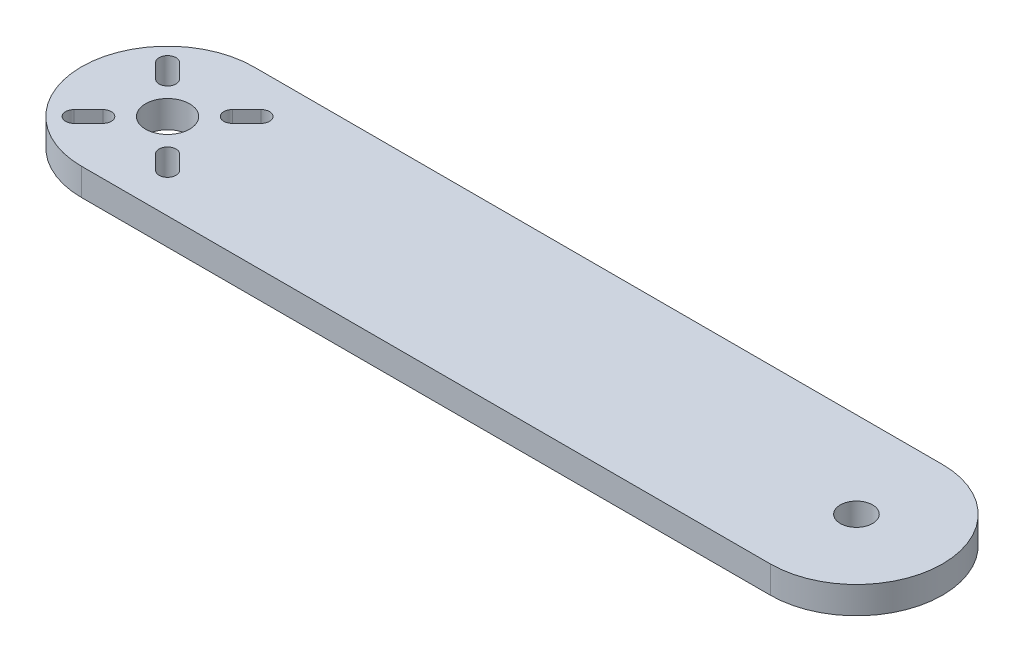
ISO-10303-21;
HEADER;
FILE_DESCRIPTION(('STEP AP214'),'2;1');
FILE_NAME('part.step','',(''),(''),'','','');
FILE_SCHEMA(('AUTOMOTIVE_DESIGN { 1 0 10303 214 1 1 1 1 }'));
ENDSEC;
DATA;
#1=APPLICATION_CONTEXT('core data for automotive mechanical design processes');
#2=APPLICATION_PROTOCOL_DEFINITION('international standard','automotive_design',2000,#1);
#3=PRODUCT_CONTEXT('',#1,'mechanical');
#4=PRODUCT('Part','Part','',(#3));
#5=PRODUCT_RELATED_PRODUCT_CATEGORY('part','',(#4));
#6=PRODUCT_DEFINITION_FORMATION('','',#4);
#7=PRODUCT_DEFINITION_CONTEXT('part definition',#1,'design');
#8=PRODUCT_DEFINITION('design','',#6,#7);
#9=PRODUCT_DEFINITION_SHAPE('','',#8);
#10=(LENGTH_UNIT() NAMED_UNIT(*) SI_UNIT(.MILLI.,.METRE.));
#11=(NAMED_UNIT(*) PLANE_ANGLE_UNIT() SI_UNIT($,.RADIAN.));
#12=(NAMED_UNIT(*) SI_UNIT($,.STERADIAN.) SOLID_ANGLE_UNIT());
#13=UNCERTAINTY_MEASURE_WITH_UNIT(LENGTH_MEASURE(1.E-05),#10,'distance_accuracy_value','');
#14=(GEOMETRIC_REPRESENTATION_CONTEXT(3) GLOBAL_UNCERTAINTY_ASSIGNED_CONTEXT((#13)) GLOBAL_UNIT_ASSIGNED_CONTEXT((#10,
#11,#12)) REPRESENTATION_CONTEXT('',''));
#15=CARTESIAN_POINT('',(0.,0.,0.));
#16=DIRECTION('',(0.,0.,1.));
#17=DIRECTION('',(1.,0.,0.));
#18=AXIS2_PLACEMENT_3D('',#15,#16,#17);
#19=CARTESIAN_POINT('',(50.8,4.,0.));
#20=DIRECTION('',(0.,1.,0.));
#21=DIRECTION('',(0.,0.,1.));
#22=AXIS2_PLACEMENT_3D('',#19,#20,#21);
#23=PLANE('',#22);
#24=DIRECTION('',(0.707106781186583,0.,0.707106781186512));
#25=VECTOR('',#24,1.);
#26=CARTESIAN_POINT('',(-58.5781745930529,4.,-6.01040764008468));
#27=LINE('',#26,#25);
#28=CARTESIAN_POINT('',(-58.5781745930529,4.,-6.01040764008468));
#29=VERTEX_POINT('',#28);
#30=CARTESIAN_POINT('',(-56.4568542494935,4.,-3.88908729652476));
#31=VERTEX_POINT('',#30);
#32=EDGE_CURVE('E279',#29,#31,#27,.T.);
#33=ORIENTED_EDGE('',*,*,#32,.F.);
#34=CARTESIAN_POINT('',(-57.6942911165697,4.,-6.89429111656791));
#35=DIRECTION('',(0.,1.,0.));
#36=DIRECTION('',(0.,0.,1.));
#37=AXIS2_PLACEMENT_3D('',#34,#35,#36);
#38=CIRCLE('',#37,1.25);
#39=CARTESIAN_POINT('',(-56.8104076400866,4.,-7.77817459305114));
#40=VERTEX_POINT('',#39);
#41=EDGE_CURVE('E277',#40,#29,#38,.T.);
#42=ORIENTED_EDGE('',*,*,#41,.F.);
#43=DIRECTION('',(-0.707106781186835,0.,-0.70710678118626));
#44=VECTOR('',#43,1.);
#45=CARTESIAN_POINT('',(-56.8104076400866,4.,-7.77817459305114));
#46=LINE('',#45,#44);
#47=CARTESIAN_POINT('',(-54.6890872965261,4.,-5.65685424949233));
#48=VERTEX_POINT('',#47);
#49=EDGE_CURVE('E285',#48,#40,#46,.T.);
#50=ORIENTED_EDGE('',*,*,#49,.F.);
#51=CARTESIAN_POINT('',(-55.57297077301,4.,-4.77297077300838));
#52=DIRECTION('',(0.,1.,0.));
#53=DIRECTION('',(0.,0.,1.));
#54=AXIS2_PLACEMENT_3D('',#51,#52,#53);
#55=CIRCLE('',#54,1.25000000000054);
#56=EDGE_CURVE('E282',#31,#48,#55,.T.);
#57=ORIENTED_EDGE('',*,*,#56,.F.);
#58=EDGE_LOOP('',(#33,#42,#50,#57));
#59=FACE_BOUND('',#58,.T.);
#60=CARTESIAN_POINT('',(-50.8,4.,0.));
#61=DIRECTION('',(0.,1.,0.));
#62=DIRECTION('',(0.,0.,1.));
#63=AXIS2_PLACEMENT_3D('',#60,#61,#62);
#64=CIRCLE('',#63,3.25);
#65=CARTESIAN_POINT('',(-50.8,4.,3.25));
#66=VERTEX_POINT('',#65);
#67=EDGE_CURVE('E308',#66,#66,#64,.T.);
#68=ORIENTED_EDGE('',*,*,#67,.F.);
#69=EDGE_LOOP('',(#68));
#70=FACE_BOUND('',#69,.T.);
#71=CARTESIAN_POINT('',(50.8,4.,0.));
#72=DIRECTION('',(0.,1.,0.));
#73=DIRECTION('',(0.,0.,1.));
#74=AXIS2_PLACEMENT_3D('',#71,#72,#73);
#75=CIRCLE('',#74,12.7);
#76=CARTESIAN_POINT('',(50.8,4.,12.7));
#77=VERTEX_POINT('',#76);
#78=CARTESIAN_POINT('',(50.8,4.,-12.7));
#79=VERTEX_POINT('',#78);
#80=EDGE_CURVE('E314',#77,#79,#75,.T.);
#81=ORIENTED_EDGE('',*,*,#80,.T.);
#82=DIRECTION('',(-1.,0.,0.));
#83=VECTOR('',#82,1.);
#84=CARTESIAN_POINT('',(-50.8,4.,-12.7));
#85=LINE('',#84,#83);
#86=CARTESIAN_POINT('',(-50.8,4.,-12.7));
#87=VERTEX_POINT('',#86);
#88=EDGE_CURVE('E317',#79,#87,#85,.T.);
#89=ORIENTED_EDGE('',*,*,#88,.T.);
#90=CARTESIAN_POINT('',(-50.8,4.,0.));
#91=DIRECTION('',(0.,1.,0.));
#92=DIRECTION('',(0.,0.,1.));
#93=AXIS2_PLACEMENT_3D('',#90,#91,#92);
#94=CIRCLE('',#93,12.7);
#95=CARTESIAN_POINT('',(-50.8,4.,12.7));
#96=VERTEX_POINT('',#95);
#97=EDGE_CURVE('E320',#87,#96,#94,.T.);
#98=ORIENTED_EDGE('',*,*,#97,.T.);
#99=DIRECTION('',(1.,0.,0.));
#100=VECTOR('',#99,1.);
#101=CARTESIAN_POINT('',(-50.8,4.,12.7));
#102=LINE('',#101,#100);
#103=EDGE_CURVE('E322',#96,#77,#102,.T.);
#104=ORIENTED_EDGE('',*,*,#103,.T.);
#105=EDGE_LOOP('',(#81,#89,#98,#104));
#106=FACE_BOUND('',#105,.T.);
#107=CARTESIAN_POINT('',(50.8,4.,0.));
#108=DIRECTION('',(0.,1.,0.));
#109=DIRECTION('',(0.,0.,1.));
#110=AXIS2_PLACEMENT_3D('',#107,#108,#109);
#111=CIRCLE('',#110,2.38125);
#112=CARTESIAN_POINT('',(50.8,4.,2.38125));
#113=VERTEX_POINT('',#112);
#114=EDGE_CURVE('E271',#113,#113,#111,.T.);
#115=ORIENTED_EDGE('',*,*,#114,.F.);
#116=EDGE_LOOP('',(#115));
#117=FACE_BOUND('',#116,.T.);
#118=DIRECTION('',(-0.707106781186541,0.,0.707106781186554));
#119=VECTOR('',#118,1.);
#120=CARTESIAN_POINT('',(-44.7895923599144,4.,-7.77817459305228));
#121=LINE('',#120,#119);
#122=CARTESIAN_POINT('',(-44.7895923599144,4.,-7.77817459305228));
#123=VERTEX_POINT('',#122);
#124=CARTESIAN_POINT('',(-46.9109127034743,4.,-5.65685424949283));
#125=VERTEX_POINT('',#124);
#126=EDGE_CURVE('E242',#123,#125,#121,.T.);
#127=ORIENTED_EDGE('',*,*,#126,.F.);
#128=CARTESIAN_POINT('',(-43.9057088834314,4.,-6.89429111656933));
#129=DIRECTION('',(0.,1.,0.));
#130=DIRECTION('',(0.,0.,1.));
#131=AXIS2_PLACEMENT_3D('',#128,#129,#130);
#132=CIRCLE('',#131,1.25);
#133=CARTESIAN_POINT('',(-43.021825406948,4.,-6.01040764008592));
#134=VERTEX_POINT('',#133);
#135=EDGE_CURVE('E240',#134,#123,#132,.T.);
#136=ORIENTED_EDGE('',*,*,#135,.F.);
#137=DIRECTION('',(0.707106781186541,0.,-0.707106781186554));
#138=VECTOR('',#137,1.);
#139=CARTESIAN_POINT('',(-43.021825406948,4.,-6.01040764008592));
#140=LINE('',#139,#138);
#141=CARTESIAN_POINT('',(-45.1431457505076,4.,-3.88908729652627));
#142=VERTEX_POINT('',#141);
#143=EDGE_CURVE('E248',#142,#134,#140,.T.);
#144=ORIENTED_EDGE('',*,*,#143,.F.);
#145=CARTESIAN_POINT('',(-46.0270292269911,4.,-4.77297077300963));
#146=DIRECTION('',(0.,1.,0.));
#147=DIRECTION('',(0.,0.,1.));
#148=AXIS2_PLACEMENT_3D('',#145,#146,#147);
#149=CIRCLE('',#148,1.25);
#150=EDGE_CURVE('E245',#125,#142,#149,.T.);
#151=ORIENTED_EDGE('',*,*,#150,.F.);
#152=EDGE_LOOP('',(#127,#136,#144,#151));
#153=FACE_BOUND('',#152,.T.);
#154=DIRECTION('',(-0.707106781186552,0.,-0.707106781186543));
#155=VECTOR('',#154,1.);
#156=CARTESIAN_POINT('',(-43.0218254069477,4.,6.01040764008542));
#157=LINE('',#156,#155);
#158=CARTESIAN_POINT('',(-43.0218254069477,4.,6.01040764008542));
#159=VERTEX_POINT('',#158);
#160=CARTESIAN_POINT('',(-45.1431457505076,4.,3.88908729652599));
#161=VERTEX_POINT('',#160);
#162=EDGE_CURVE('E211',#159,#161,#157,.T.);
#163=ORIENTED_EDGE('',*,*,#162,.F.);
#164=CARTESIAN_POINT('',(-43.9057088834307,4.,6.89429111656839));
#165=DIRECTION('',(0.,1.,0.));
#166=DIRECTION('',(0.,0.,1.));
#167=AXIS2_PLACEMENT_3D('',#164,#165,#166);
#168=CIRCLE('',#167,1.24999999999938);
#169=CARTESIAN_POINT('',(-44.7895923599132,4.,7.77817459305092));
#170=VERTEX_POINT('',#169);
#171=EDGE_CURVE('E209',#170,#159,#168,.T.);
#172=ORIENTED_EDGE('',*,*,#171,.F.);
#173=DIRECTION('',(0.707106781186557,0.,0.707106781186538));
#174=VECTOR('',#173,1.);
#175=CARTESIAN_POINT('',(-44.7895923599132,4.,7.77817459305092));
#176=LINE('',#175,#174);
#177=CARTESIAN_POINT('',(-46.9109127034729,4.,5.65685424949133));
#178=VERTEX_POINT('',#177);
#179=EDGE_CURVE('E217',#178,#170,#176,.T.);
#180=ORIENTED_EDGE('',*,*,#179,.F.);
#181=CARTESIAN_POINT('',(-46.0270292269904,4.,4.77297077300873));
#182=DIRECTION('',(0.,1.,0.));
#183=DIRECTION('',(0.,0.,1.));
#184=AXIS2_PLACEMENT_3D('',#181,#182,#183);
#185=CIRCLE('',#184,1.24999999999939);
#186=EDGE_CURVE('E214',#161,#178,#185,.T.);
#187=ORIENTED_EDGE('',*,*,#186,.F.);
#188=EDGE_LOOP('',(#163,#172,#180,#187));
#189=FACE_BOUND('',#188,.T.);
#190=DIRECTION('',(0.707106781186545,0.,-0.70710678118655));
#191=VECTOR('',#190,1.);
#192=CARTESIAN_POINT('',(-56.8104076400854,4.,7.77817459305205));
#193=LINE('',#192,#191);
#194=CARTESIAN_POINT('',(-56.8104076400854,4.,7.77817459305205));
#195=VERTEX_POINT('',#194);
#196=CARTESIAN_POINT('',(-54.689087296526,4.,5.65685424949218));
#197=VERTEX_POINT('',#196);
#198=EDGE_CURVE('E181',#195,#197,#193,.T.);
#199=ORIENTED_EDGE('',*,*,#198,.F.);
#200=CARTESIAN_POINT('',(-57.6942911165684,4.,6.8942911165691));
#201=DIRECTION('',(0.,1.,0.));
#202=DIRECTION('',(0.,0.,1.));
#203=AXIS2_PLACEMENT_3D('',#200,#201,#202);
#204=CIRCLE('',#203,1.24999999999937);
#205=CARTESIAN_POINT('',(-58.5781745930509,4.,6.01040764008659));
#206=VERTEX_POINT('',#205);
#207=EDGE_CURVE('E173',#206,#195,#204,.T.);
#208=ORIENTED_EDGE('',*,*,#207,.F.);
#209=DIRECTION('',(-0.707106781186538,0.,0.707106781186557));
#210=VECTOR('',#209,1.);
#211=CARTESIAN_POINT('',(-58.5781745930509,4.,6.01040764008659));
#212=LINE('',#211,#210);
#213=CARTESIAN_POINT('',(-56.4568542494913,4.,3.88908729652692));
#214=VERTEX_POINT('',#213);
#215=EDGE_CURVE('E195',#214,#206,#212,.T.);
#216=ORIENTED_EDGE('',*,*,#215,.F.);
#217=CARTESIAN_POINT('',(-55.5729707730087,4.,4.77297077300941));
#218=DIRECTION('',(0.,1.,0.));
#219=DIRECTION('',(0.,0.,1.));
#220=AXIS2_PLACEMENT_3D('',#217,#218,#219);
#221=CIRCLE('',#220,1.24999999999938);
#222=EDGE_CURVE('E193',#197,#214,#221,.T.);
#223=ORIENTED_EDGE('',*,*,#222,.F.);
#224=EDGE_LOOP('',(#199,#208,#216,#223));
#225=FACE_BOUND('',#224,.T.);
#226=ADVANCED_FACE('F36',(#59,#70,#106,#117,#153,#189,#225),#23,.T.);
#227=CARTESIAN_POINT('',(50.8,0.,0.));
#228=DIRECTION('',(0.,1.,0.));
#229=DIRECTION('',(0.,0.,1.));
#230=AXIS2_PLACEMENT_3D('',#227,#228,#229);
#231=PLANE('',#230);
#232=CARTESIAN_POINT('',(-43.9057088834307,0.,6.89429111656839));
#233=DIRECTION('',(0.,1.,0.));
#234=DIRECTION('',(0.,0.,1.));
#235=AXIS2_PLACEMENT_3D('',#232,#233,#234);
#236=CIRCLE('',#235,1.24999999999938);
#237=CARTESIAN_POINT('',(-44.7895923599132,0.,7.77817459305091));
#238=VERTEX_POINT('',#237);
#239=CARTESIAN_POINT('',(-43.0218254069477,0.,6.01040764008542));
#240=VERTEX_POINT('',#239);
#241=EDGE_CURVE('E189',#238,#240,#236,.T.);
#242=ORIENTED_EDGE('',*,*,#241,.T.);
#243=DIRECTION('',(-0.707106781186552,0.,-0.707106781186543));
#244=VECTOR('',#243,1.);
#245=CARTESIAN_POINT('',(-43.0218254069477,0.,6.01040764008542));
#246=LINE('',#245,#244);
#247=CARTESIAN_POINT('',(-45.1431457505076,0.,3.88908729652599));
#248=VERTEX_POINT('',#247);
#249=EDGE_CURVE('E222',#240,#248,#246,.T.);
#250=ORIENTED_EDGE('',*,*,#249,.T.);
#251=CARTESIAN_POINT('',(-46.0270292269904,0.,4.77297077300873));
#252=DIRECTION('',(0.,1.,0.));
#253=DIRECTION('',(0.,0.,1.));
#254=AXIS2_PLACEMENT_3D('',#251,#252,#253);
#255=CIRCLE('',#254,1.24999999999939);
#256=CARTESIAN_POINT('',(-46.9109127034729,0.,5.65685424949131));
#257=VERTEX_POINT('',#256);
#258=EDGE_CURVE('E225',#248,#257,#255,.T.);
#259=ORIENTED_EDGE('',*,*,#258,.T.);
#260=DIRECTION('',(0.707106781186557,0.,0.707106781186538));
#261=VECTOR('',#260,1.);
#262=CARTESIAN_POINT('',(-44.7895923599132,0.,7.77817459305092));
#263=LINE('',#262,#261);
#264=EDGE_CURVE('E212',#257,#238,#263,.T.);
#265=ORIENTED_EDGE('',*,*,#264,.T.);
#266=EDGE_LOOP('',(#242,#250,#259,#265));
#267=FACE_BOUND('',#266,.T.);
#268=CARTESIAN_POINT('',(50.8,0.,0.));
#269=DIRECTION('',(0.,1.,0.));
#270=DIRECTION('',(0.,0.,1.));
#271=AXIS2_PLACEMENT_3D('',#268,#269,#270);
#272=CIRCLE('',#271,2.38125);
#273=CARTESIAN_POINT('',(50.8,0.,2.38125));
#274=VERTEX_POINT('',#273);
#275=EDGE_CURVE('E270',#274,#274,#272,.T.);
#276=ORIENTED_EDGE('',*,*,#275,.T.);
#277=EDGE_LOOP('',(#276));
#278=FACE_BOUND('',#277,.T.);
#279=CARTESIAN_POINT('',(-57.6942911165697,0.,-6.89429111656791));
#280=DIRECTION('',(0.,1.,0.));
#281=DIRECTION('',(0.,0.,1.));
#282=AXIS2_PLACEMENT_3D('',#279,#280,#281);
#283=CIRCLE('',#282,1.25);
#284=CARTESIAN_POINT('',(-56.8104076400866,0.,-7.77817459305114));
#285=VERTEX_POINT('',#284);
#286=CARTESIAN_POINT('',(-58.5781745930529,0.,-6.01040764008468));
#287=VERTEX_POINT('',#286);
#288=EDGE_CURVE('E274',#285,#287,#283,.T.);
#289=ORIENTED_EDGE('',*,*,#288,.T.);
#290=DIRECTION('',(0.707106781186583,0.,0.707106781186512));
#291=VECTOR('',#290,1.);
#292=CARTESIAN_POINT('',(-58.5781745930529,0.,-6.01040764008468));
#293=LINE('',#292,#291);
#294=CARTESIAN_POINT('',(-56.4568542494935,0.,-3.88908729652476));
#295=VERTEX_POINT('',#294);
#296=EDGE_CURVE('E290',#287,#295,#293,.T.);
#297=ORIENTED_EDGE('',*,*,#296,.T.);
#298=CARTESIAN_POINT('',(-55.57297077301,0.,-4.77297077300838));
#299=DIRECTION('',(0.,1.,0.));
#300=DIRECTION('',(0.,0.,1.));
#301=AXIS2_PLACEMENT_3D('',#298,#299,#300);
#302=CIRCLE('',#301,1.25000000000054);
#303=CARTESIAN_POINT('',(-54.6890872965261,0.,-5.65685424949233));
#304=VERTEX_POINT('',#303);
#305=EDGE_CURVE('E293',#295,#304,#302,.T.);
#306=ORIENTED_EDGE('',*,*,#305,.T.);
#307=DIRECTION('',(-0.707106781186835,0.,-0.70710678118626));
#308=VECTOR('',#307,1.);
#309=CARTESIAN_POINT('',(-56.8104076400866,0.,-7.77817459305114));
#310=LINE('',#309,#308);
#311=EDGE_CURVE('E280',#304,#285,#310,.T.);
#312=ORIENTED_EDGE('',*,*,#311,.T.);
#313=EDGE_LOOP('',(#289,#297,#306,#312));
#314=FACE_BOUND('',#313,.T.);
#315=CARTESIAN_POINT('',(50.8,0.,0.));
#316=DIRECTION('',(0.,1.,0.));
#317=DIRECTION('',(0.,0.,1.));
#318=AXIS2_PLACEMENT_3D('',#315,#316,#317);
#319=CIRCLE('',#318,12.7);
#320=CARTESIAN_POINT('',(50.8,0.,12.7));
#321=VERTEX_POINT('',#320);
#322=CARTESIAN_POINT('',(50.8,0.,-12.7));
#323=VERTEX_POINT('',#322);
#324=EDGE_CURVE('E311',#321,#323,#319,.T.);
#325=ORIENTED_EDGE('',*,*,#324,.F.);
#326=DIRECTION('',(1.,0.,0.));
#327=VECTOR('',#326,1.);
#328=CARTESIAN_POINT('',(-50.8,0.,12.7));
#329=LINE('',#328,#327);
#330=CARTESIAN_POINT('',(-50.8,0.,12.7));
#331=VERTEX_POINT('',#330);
#332=EDGE_CURVE('E318',#331,#321,#329,.T.);
#333=ORIENTED_EDGE('',*,*,#332,.F.);
#334=CARTESIAN_POINT('',(-50.8,0.,0.));
#335=DIRECTION('',(0.,1.,0.));
#336=DIRECTION('',(0.,0.,1.));
#337=AXIS2_PLACEMENT_3D('',#334,#335,#336);
#338=CIRCLE('',#337,12.7);
#339=CARTESIAN_POINT('',(-50.8,0.,-12.7));
#340=VERTEX_POINT('',#339);
#341=EDGE_CURVE('E329',#340,#331,#338,.T.);
#342=ORIENTED_EDGE('',*,*,#341,.F.);
#343=DIRECTION('',(-1.,0.,0.));
#344=VECTOR('',#343,1.);
#345=CARTESIAN_POINT('',(-50.8,0.,-12.7));
#346=LINE('',#345,#344);
#347=EDGE_CURVE('E327',#323,#340,#346,.T.);
#348=ORIENTED_EDGE('',*,*,#347,.F.);
#349=EDGE_LOOP('',(#325,#333,#342,#348));
#350=FACE_BOUND('',#349,.T.);
#351=CARTESIAN_POINT('',(-50.8,0.,0.));
#352=DIRECTION('',(0.,1.,0.));
#353=DIRECTION('',(0.,0.,1.));
#354=AXIS2_PLACEMENT_3D('',#351,#352,#353);
#355=CIRCLE('',#354,3.25);
#356=CARTESIAN_POINT('',(-50.8,0.,3.25));
#357=VERTEX_POINT('',#356);
#358=EDGE_CURVE('E307',#357,#357,#355,.T.);
#359=ORIENTED_EDGE('',*,*,#358,.T.);
#360=EDGE_LOOP('',(#359));
#361=FACE_BOUND('',#360,.T.);
#362=CARTESIAN_POINT('',(-43.9057088834314,0.,-6.89429111656933));
#363=DIRECTION('',(0.,1.,0.));
#364=DIRECTION('',(0.,0.,1.));
#365=AXIS2_PLACEMENT_3D('',#362,#363,#364);
#366=CIRCLE('',#365,1.25);
#367=CARTESIAN_POINT('',(-43.021825406948,0.,-6.01040764008593));
#368=VERTEX_POINT('',#367);
#369=CARTESIAN_POINT('',(-44.7895923599144,0.,-7.77817459305228));
#370=VERTEX_POINT('',#369);
#371=EDGE_CURVE('E239',#368,#370,#366,.T.);
#372=ORIENTED_EDGE('',*,*,#371,.T.);
#373=DIRECTION('',(-0.707106781186541,0.,0.707106781186554));
#374=VECTOR('',#373,1.);
#375=CARTESIAN_POINT('',(-44.7895923599144,0.,-7.77817459305228));
#376=LINE('',#375,#374);
#377=CARTESIAN_POINT('',(-46.9109127034743,0.,-5.65685424949283));
#378=VERTEX_POINT('',#377);
#379=EDGE_CURVE('E253',#370,#378,#376,.T.);
#380=ORIENTED_EDGE('',*,*,#379,.T.);
#381=CARTESIAN_POINT('',(-46.0270292269911,0.,-4.77297077300963));
#382=DIRECTION('',(0.,1.,0.));
#383=DIRECTION('',(0.,0.,1.));
#384=AXIS2_PLACEMENT_3D('',#381,#382,#383);
#385=CIRCLE('',#384,1.25);
#386=CARTESIAN_POINT('',(-45.1431457505076,0.,-3.88908729652625));
#387=VERTEX_POINT('',#386);
#388=EDGE_CURVE('E256',#378,#387,#385,.T.);
#389=ORIENTED_EDGE('',*,*,#388,.T.);
#390=DIRECTION('',(0.707106781186541,0.,-0.707106781186554));
#391=VECTOR('',#390,1.);
#392=CARTESIAN_POINT('',(-43.021825406948,0.,-6.01040764008592));
#393=LINE('',#392,#391);
#394=EDGE_CURVE('E243',#387,#368,#393,.T.);
#395=ORIENTED_EDGE('',*,*,#394,.T.);
#396=EDGE_LOOP('',(#372,#380,#389,#395));
#397=FACE_BOUND('',#396,.T.);
#398=CARTESIAN_POINT('',(-57.6942911165684,0.,6.8942911165691));
#399=DIRECTION('',(0.,1.,0.));
#400=DIRECTION('',(0.,0.,1.));
#401=AXIS2_PLACEMENT_3D('',#398,#399,#400);
#402=CIRCLE('',#401,1.24999999999937);
#403=CARTESIAN_POINT('',(-58.5781745930509,0.,6.01040764008658));
#404=VERTEX_POINT('',#403);
#405=CARTESIAN_POINT('',(-56.8104076400854,0.,7.77817459305205));
#406=VERTEX_POINT('',#405);
#407=EDGE_CURVE('E59',#404,#406,#402,.T.);
#408=ORIENTED_EDGE('',*,*,#407,.T.);
#409=DIRECTION('',(0.707106781186545,0.,-0.70710678118655));
#410=VECTOR('',#409,1.);
#411=CARTESIAN_POINT('',(-56.8104076400854,0.,7.77817459305205));
#412=LINE('',#411,#410);
#413=CARTESIAN_POINT('',(-54.689087296526,0.,5.65685424949218));
#414=VERTEX_POINT('',#413);
#415=EDGE_CURVE('E188',#406,#414,#412,.T.);
#416=ORIENTED_EDGE('',*,*,#415,.T.);
#417=CARTESIAN_POINT('',(-55.5729707730087,0.,4.77297077300941));
#418=DIRECTION('',(0.,1.,0.));
#419=DIRECTION('',(0.,0.,1.));
#420=AXIS2_PLACEMENT_3D('',#417,#418,#419);
#421=CIRCLE('',#420,1.24999999999938);
#422=CARTESIAN_POINT('',(-56.4568542494913,0.,3.88908729652692));
#423=VERTEX_POINT('',#422);
#424=EDGE_CURVE('E201',#414,#423,#421,.T.);
#425=ORIENTED_EDGE('',*,*,#424,.T.);
#426=DIRECTION('',(-0.707106781186538,0.,0.707106781186557));
#427=VECTOR('',#426,1.);
#428=CARTESIAN_POINT('',(-58.5781745930509,0.,6.01040764008659));
#429=LINE('',#428,#427);
#430=EDGE_CURVE('E182',#423,#404,#429,.T.);
#431=ORIENTED_EDGE('',*,*,#430,.T.);
#432=EDGE_LOOP('',(#408,#416,#425,#431));
#433=FACE_BOUND('',#432,.T.);
#434=ADVANCED_FACE('F347',(#267,#278,#314,#350,#361,#397,#433),#231,.F.);
#435=CARTESIAN_POINT('',(50.8,4.,0.));
#436=DIRECTION('',(0.,-1.,0.));
#437=DIRECTION('',(0.,0.,-1.));
#438=AXIS2_PLACEMENT_3D('',#435,#436,#437);
#439=CYLINDRICAL_SURFACE('',#438,12.7);
#440=ORIENTED_EDGE('',*,*,#324,.T.);
#441=DIRECTION('',(0.,-1.,0.));
#442=VECTOR('',#441,1.);
#443=CARTESIAN_POINT('',(50.8,4.,-12.7));
#444=LINE('',#443,#442);
#445=EDGE_CURVE('E11',#79,#323,#444,.T.);
#446=ORIENTED_EDGE('',*,*,#445,.F.);
#447=ORIENTED_EDGE('',*,*,#80,.F.);
#448=DIRECTION('',(0.,-1.,0.));
#449=VECTOR('',#448,1.);
#450=CARTESIAN_POINT('',(50.8,4.,12.7));
#451=LINE('',#450,#449);
#452=EDGE_CURVE('E324',#77,#321,#451,.T.);
#453=ORIENTED_EDGE('',*,*,#452,.T.);
#454=EDGE_LOOP('',(#440,#446,#447,#453));
#455=FACE_BOUND('',#454,.T.);
#456=ADVANCED_FACE('F38',(#455),#439,.T.);
#457=CARTESIAN_POINT('',(-50.8,4.,-12.7));
#458=DIRECTION('',(0.,0.,1.));
#459=DIRECTION('',(1.,0.,0.));
#460=AXIS2_PLACEMENT_3D('',#457,#458,#459);
#461=PLANE('',#460);
#462=ORIENTED_EDGE('',*,*,#347,.T.);
#463=DIRECTION('',(0.,-1.,0.));
#464=VECTOR('',#463,1.);
#465=CARTESIAN_POINT('',(-50.8,4.,-12.7));
#466=LINE('',#465,#464);
#467=EDGE_CURVE('E44',#87,#340,#466,.T.);
#468=ORIENTED_EDGE('',*,*,#467,.F.);
#469=ORIENTED_EDGE('',*,*,#88,.F.);
#470=ORIENTED_EDGE('',*,*,#445,.T.);
#471=EDGE_LOOP('',(#462,#468,#469,#470));
#472=FACE_BOUND('',#471,.T.);
#473=ADVANCED_FACE('F358',(#472),#461,.F.);
#474=CARTESIAN_POINT('',(-50.8,4.,0.));
#475=DIRECTION('',(0.,-1.,0.));
#476=DIRECTION('',(0.,0.,-1.));
#477=AXIS2_PLACEMENT_3D('',#474,#475,#476);
#478=CYLINDRICAL_SURFACE('',#477,12.7);
#479=ORIENTED_EDGE('',*,*,#341,.T.);
#480=DIRECTION('',(0.,-1.,0.));
#481=VECTOR('',#480,1.);
#482=CARTESIAN_POINT('',(-50.8,4.,12.7));
#483=LINE('',#482,#481);
#484=EDGE_CURVE('E334',#96,#331,#483,.T.);
#485=ORIENTED_EDGE('',*,*,#484,.F.);
#486=ORIENTED_EDGE('',*,*,#97,.F.);
#487=ORIENTED_EDGE('',*,*,#467,.T.);
#488=EDGE_LOOP('',(#479,#485,#486,#487));
#489=FACE_BOUND('',#488,.T.);
#490=ADVANCED_FACE('F341',(#489),#478,.T.);
#491=CARTESIAN_POINT('',(-50.8,4.,12.7));
#492=DIRECTION('',(0.,0.,-1.));
#493=DIRECTION('',(-1.,0.,0.));
#494=AXIS2_PLACEMENT_3D('',#491,#492,#493);
#495=PLANE('',#494);
#496=ORIENTED_EDGE('',*,*,#332,.T.);
#497=ORIENTED_EDGE('',*,*,#452,.F.);
#498=ORIENTED_EDGE('',*,*,#103,.F.);
#499=ORIENTED_EDGE('',*,*,#484,.T.);
#500=EDGE_LOOP('',(#496,#497,#498,#499));
#501=FACE_BOUND('',#500,.T.);
#502=ADVANCED_FACE('F351',(#501),#495,.F.);
#503=CARTESIAN_POINT('',(-50.8,4.,0.));
#504=DIRECTION('',(0.,-1.,0.));
#505=DIRECTION('',(0.,0.,-1.));
#506=AXIS2_PLACEMENT_3D('',#503,#504,#505);
#507=CYLINDRICAL_SURFACE('',#506,3.25);
#508=ORIENTED_EDGE('',*,*,#67,.T.);
#509=EDGE_LOOP('',(#508));
#510=FACE_BOUND('',#509,.T.);
#511=ORIENTED_EDGE('',*,*,#358,.F.);
#512=EDGE_LOOP('',(#511));
#513=FACE_BOUND('',#512,.T.);
#514=ADVANCED_FACE('F376',(#510,#513),#507,.F.);
#515=CARTESIAN_POINT('',(-57.6942911165697,4.,-6.89429111656791));
#516=DIRECTION('',(0.,-1.,0.));
#517=DIRECTION('',(0.,0.,-1.));
#518=AXIS2_PLACEMENT_3D('',#515,#516,#517);
#519=CYLINDRICAL_SURFACE('',#518,1.25);
#520=ORIENTED_EDGE('',*,*,#288,.F.);
#521=DIRECTION('',(0.,-1.,0.));
#522=VECTOR('',#521,1.);
#523=CARTESIAN_POINT('',(-56.8104076400866,4.,-7.77817459305114));
#524=LINE('',#523,#522);
#525=EDGE_CURVE('E287',#40,#285,#524,.T.);
#526=ORIENTED_EDGE('',*,*,#525,.F.);
#527=ORIENTED_EDGE('',*,*,#41,.T.);
#528=DIRECTION('',(0.,-1.,0.));
#529=VECTOR('',#528,1.);
#530=CARTESIAN_POINT('',(-58.5781745930529,4.,-6.01040764008468));
#531=LINE('',#530,#529);
#532=EDGE_CURVE('E304',#29,#287,#531,.T.);
#533=ORIENTED_EDGE('',*,*,#532,.T.);
#534=EDGE_LOOP('',(#520,#526,#527,#533));
#535=FACE_BOUND('',#534,.T.);
#536=ADVANCED_FACE('F383',(#535),#519,.F.);
#537=CARTESIAN_POINT('',(-58.5781745930529,4.,-6.01040764008468));
#538=DIRECTION('',(0.707106781186512,0.,-0.707106781186583));
#539=DIRECTION('',(-0.707106781186583,0.,-0.707106781186512));
#540=AXIS2_PLACEMENT_3D('',#537,#538,#539);
#541=PLANE('',#540);
#542=ORIENTED_EDGE('',*,*,#296,.F.);
#543=ORIENTED_EDGE('',*,*,#532,.F.);
#544=ORIENTED_EDGE('',*,*,#32,.T.);
#545=DIRECTION('',(0.,-1.,0.));
#546=VECTOR('',#545,1.);
#547=CARTESIAN_POINT('',(-56.4568542494935,4.,-3.88908729652476));
#548=LINE('',#547,#546);
#549=EDGE_CURVE('E302',#31,#295,#548,.T.);
#550=ORIENTED_EDGE('',*,*,#549,.T.);
#551=EDGE_LOOP('',(#542,#543,#544,#550));
#552=FACE_BOUND('',#551,.T.);
#553=ADVANCED_FACE('F388',(#552),#541,.T.);
#554=CARTESIAN_POINT('',(-55.57297077301,4.,-4.77297077300838));
#555=DIRECTION('',(0.,-1.,0.));
#556=DIRECTION('',(0.,0.,-1.));
#557=AXIS2_PLACEMENT_3D('',#554,#555,#556);
#558=CYLINDRICAL_SURFACE('',#557,1.25000000000054);
#559=ORIENTED_EDGE('',*,*,#305,.F.);
#560=ORIENTED_EDGE('',*,*,#549,.F.);
#561=ORIENTED_EDGE('',*,*,#56,.T.);
#562=DIRECTION('',(0.,-1.,0.));
#563=VECTOR('',#562,1.);
#564=CARTESIAN_POINT('',(-54.6890872965261,4.,-5.65685424949233));
#565=LINE('',#564,#563);
#566=EDGE_CURVE('E300',#48,#304,#565,.T.);
#567=ORIENTED_EDGE('',*,*,#566,.T.);
#568=EDGE_LOOP('',(#559,#560,#561,#567));
#569=FACE_BOUND('',#568,.T.);
#570=ADVANCED_FACE('F449',(#569),#558,.F.);
#571=CARTESIAN_POINT('',(-56.8104076400866,4.,-7.77817459305114));
#572=DIRECTION('',(-0.70710678118626,0.,0.707106781186835));
#573=DIRECTION('',(0.707106781186835,0.,0.70710678118626));
#574=AXIS2_PLACEMENT_3D('',#571,#572,#573);
#575=PLANE('',#574);
#576=ORIENTED_EDGE('',*,*,#311,.F.);
#577=ORIENTED_EDGE('',*,*,#566,.F.);
#578=ORIENTED_EDGE('',*,*,#49,.T.);
#579=ORIENTED_EDGE('',*,*,#525,.T.);
#580=EDGE_LOOP('',(#576,#577,#578,#579));
#581=FACE_BOUND('',#580,.T.);
#582=ADVANCED_FACE('F445',(#581),#575,.T.);
#583=CARTESIAN_POINT('',(50.8,4.,0.));
#584=DIRECTION('',(0.,-1.,0.));
#585=DIRECTION('',(0.,0.,-1.));
#586=AXIS2_PLACEMENT_3D('',#583,#584,#585);
#587=CYLINDRICAL_SURFACE('',#586,2.38125);
#588=ORIENTED_EDGE('',*,*,#114,.T.);
#589=EDGE_LOOP('',(#588));
#590=FACE_BOUND('',#589,.T.);
#591=ORIENTED_EDGE('',*,*,#275,.F.);
#592=EDGE_LOOP('',(#591));
#593=FACE_BOUND('',#592,.T.);
#594=ADVANCED_FACE('F441',(#590,#593),#587,.F.);
#595=CARTESIAN_POINT('',(-43.9057088834314,4.,-6.89429111656933));
#596=DIRECTION('',(0.,-1.,0.));
#597=DIRECTION('',(0.,0.,-1.));
#598=AXIS2_PLACEMENT_3D('',#595,#596,#597);
#599=CYLINDRICAL_SURFACE('',#598,1.25);
#600=ORIENTED_EDGE('',*,*,#371,.F.);
#601=DIRECTION('',(0.,-1.,0.));
#602=VECTOR('',#601,1.);
#603=CARTESIAN_POINT('',(-43.021825406948,4.,-6.01040764008592));
#604=LINE('',#603,#602);
#605=EDGE_CURVE('E250',#134,#368,#604,.T.);
#606=ORIENTED_EDGE('',*,*,#605,.F.);
#607=ORIENTED_EDGE('',*,*,#135,.T.);
#608=DIRECTION('',(0.,-1.,0.));
#609=VECTOR('',#608,1.);
#610=CARTESIAN_POINT('',(-44.7895923599144,4.,-7.77817459305228));
#611=LINE('',#610,#609);
#612=EDGE_CURVE('E267',#123,#370,#611,.T.);
#613=ORIENTED_EDGE('',*,*,#612,.T.);
#614=EDGE_LOOP('',(#600,#606,#607,#613));
#615=FACE_BOUND('',#614,.T.);
#616=ADVANCED_FACE('F437',(#615),#599,.F.);
#617=CARTESIAN_POINT('',(-44.7895923599144,4.,-7.77817459305228));
#618=DIRECTION('',(0.707106781186554,0.,0.707106781186541));
#619=DIRECTION('',(0.707106781186541,0.,-0.707106781186554));
#620=AXIS2_PLACEMENT_3D('',#617,#618,#619);
#621=PLANE('',#620);
#622=ORIENTED_EDGE('',*,*,#379,.F.);
#623=ORIENTED_EDGE('',*,*,#612,.F.);
#624=ORIENTED_EDGE('',*,*,#126,.T.);
#625=DIRECTION('',(0.,-1.,0.));
#626=VECTOR('',#625,1.);
#627=CARTESIAN_POINT('',(-46.9109127034743,4.,-5.65685424949283));
#628=LINE('',#627,#626);
#629=EDGE_CURVE('E265',#125,#378,#628,.T.);
#630=ORIENTED_EDGE('',*,*,#629,.T.);
#631=EDGE_LOOP('',(#622,#623,#624,#630));
#632=FACE_BOUND('',#631,.T.);
#633=ADVANCED_FACE('F433',(#632),#621,.T.);
#634=CARTESIAN_POINT('',(-46.0270292269911,4.,-4.77297077300963));
#635=DIRECTION('',(0.,-1.,0.));
#636=DIRECTION('',(0.,0.,-1.));
#637=AXIS2_PLACEMENT_3D('',#634,#635,#636);
#638=CYLINDRICAL_SURFACE('',#637,1.25);
#639=ORIENTED_EDGE('',*,*,#388,.F.);
#640=ORIENTED_EDGE('',*,*,#629,.F.);
#641=ORIENTED_EDGE('',*,*,#150,.T.);
#642=DIRECTION('',(0.,-1.,0.));
#643=VECTOR('',#642,1.);
#644=CARTESIAN_POINT('',(-45.1431457505076,4.,-3.88908729652625));
#645=LINE('',#644,#643);
#646=EDGE_CURVE('E263',#142,#387,#645,.T.);
#647=ORIENTED_EDGE('',*,*,#646,.T.);
#648=EDGE_LOOP('',(#639,#640,#641,#647));
#649=FACE_BOUND('',#648,.T.);
#650=ADVANCED_FACE('F429',(#649),#638,.F.);
#651=CARTESIAN_POINT('',(-43.021825406948,4.,-6.01040764008592));
#652=DIRECTION('',(-0.707106781186554,0.,-0.707106781186541));
#653=DIRECTION('',(-0.707106781186541,0.,0.707106781186554));
#654=AXIS2_PLACEMENT_3D('',#651,#652,#653);
#655=PLANE('',#654);
#656=ORIENTED_EDGE('',*,*,#394,.F.);
#657=ORIENTED_EDGE('',*,*,#646,.F.);
#658=ORIENTED_EDGE('',*,*,#143,.T.);
#659=ORIENTED_EDGE('',*,*,#605,.T.);
#660=EDGE_LOOP('',(#656,#657,#658,#659));
#661=FACE_BOUND('',#660,.T.);
#662=ADVANCED_FACE('F425',(#661),#655,.T.);
#663=CARTESIAN_POINT('',(-43.9057088834307,4.,6.89429111656839));
#664=DIRECTION('',(0.,-1.,0.));
#665=DIRECTION('',(0.,0.,-1.));
#666=AXIS2_PLACEMENT_3D('',#663,#664,#665);
#667=CYLINDRICAL_SURFACE('',#666,1.24999999999938);
#668=ORIENTED_EDGE('',*,*,#241,.F.);
#669=DIRECTION('',(0.,-1.,0.));
#670=VECTOR('',#669,1.);
#671=CARTESIAN_POINT('',(-44.7895923599132,4.,7.77817459305092));
#672=LINE('',#671,#670);
#673=EDGE_CURVE('E219',#170,#238,#672,.T.);
#674=ORIENTED_EDGE('',*,*,#673,.F.);
#675=ORIENTED_EDGE('',*,*,#171,.T.);
#676=DIRECTION('',(0.,-1.,0.));
#677=VECTOR('',#676,1.);
#678=CARTESIAN_POINT('',(-43.0218254069477,4.,6.01040764008542));
#679=LINE('',#678,#677);
#680=EDGE_CURVE('E236',#159,#240,#679,.T.);
#681=ORIENTED_EDGE('',*,*,#680,.T.);
#682=EDGE_LOOP('',(#668,#674,#675,#681));
#683=FACE_BOUND('',#682,.T.);
#684=ADVANCED_FACE('F421',(#683),#667,.F.);
#685=CARTESIAN_POINT('',(-43.0218254069477,4.,6.01040764008542));
#686=DIRECTION('',(-0.707106781186543,0.,0.707106781186552));
#687=DIRECTION('',(0.707106781186552,0.,0.707106781186543));
#688=AXIS2_PLACEMENT_3D('',#685,#686,#687);
#689=PLANE('',#688);
#690=ORIENTED_EDGE('',*,*,#249,.F.);
#691=ORIENTED_EDGE('',*,*,#680,.F.);
#692=ORIENTED_EDGE('',*,*,#162,.T.);
#693=DIRECTION('',(0.,-1.,0.));
#694=VECTOR('',#693,1.);
#695=CARTESIAN_POINT('',(-45.1431457505076,4.,3.88908729652599));
#696=LINE('',#695,#694);
#697=EDGE_CURVE('E234',#161,#248,#696,.T.);
#698=ORIENTED_EDGE('',*,*,#697,.T.);
#699=EDGE_LOOP('',(#690,#691,#692,#698));
#700=FACE_BOUND('',#699,.T.);
#701=ADVANCED_FACE('F417',(#700),#689,.T.);
#702=CARTESIAN_POINT('',(-46.0270292269904,4.,4.77297077300873));
#703=DIRECTION('',(0.,-1.,0.));
#704=DIRECTION('',(0.,0.,-1.));
#705=AXIS2_PLACEMENT_3D('',#702,#703,#704);
#706=CYLINDRICAL_SURFACE('',#705,1.24999999999939);
#707=ORIENTED_EDGE('',*,*,#258,.F.);
#708=ORIENTED_EDGE('',*,*,#697,.F.);
#709=ORIENTED_EDGE('',*,*,#186,.T.);
#710=DIRECTION('',(0.,-1.,0.));
#711=VECTOR('',#710,1.);
#712=CARTESIAN_POINT('',(-46.9109127034729,4.,5.65685424949131));
#713=LINE('',#712,#711);
#714=EDGE_CURVE('E232',#178,#257,#713,.T.);
#715=ORIENTED_EDGE('',*,*,#714,.T.);
#716=EDGE_LOOP('',(#707,#708,#709,#715));
#717=FACE_BOUND('',#716,.T.);
#718=ADVANCED_FACE('F413',(#717),#706,.F.);
#719=CARTESIAN_POINT('',(-44.7895923599132,4.,7.77817459305092));
#720=DIRECTION('',(0.707106781186538,0.,-0.707106781186557));
#721=DIRECTION('',(-0.707106781186557,0.,-0.707106781186538));
#722=AXIS2_PLACEMENT_3D('',#719,#720,#721);
#723=PLANE('',#722);
#724=ORIENTED_EDGE('',*,*,#264,.F.);
#725=ORIENTED_EDGE('',*,*,#714,.F.);
#726=ORIENTED_EDGE('',*,*,#179,.T.);
#727=ORIENTED_EDGE('',*,*,#673,.T.);
#728=EDGE_LOOP('',(#724,#725,#726,#727));
#729=FACE_BOUND('',#728,.T.);
#730=ADVANCED_FACE('F410',(#729),#723,.T.);
#731=CARTESIAN_POINT('',(-57.6942911165684,4.,6.8942911165691));
#732=DIRECTION('',(0.,-1.,0.));
#733=DIRECTION('',(0.,0.,-1.));
#734=AXIS2_PLACEMENT_3D('',#731,#732,#733);
#735=CYLINDRICAL_SURFACE('',#734,1.24999999999937);
#736=ORIENTED_EDGE('',*,*,#407,.F.);
#737=DIRECTION('',(0.,-1.,0.));
#738=VECTOR('',#737,1.);
#739=CARTESIAN_POINT('',(-58.5781745930509,4.,6.01040764008659));
#740=LINE('',#739,#738);
#741=EDGE_CURVE('E177',#206,#404,#740,.T.);
#742=ORIENTED_EDGE('',*,*,#741,.F.);
#743=ORIENTED_EDGE('',*,*,#207,.T.);
#744=DIRECTION('',(0.,-1.,0.));
#745=VECTOR('',#744,1.);
#746=CARTESIAN_POINT('',(-56.8104076400854,4.,7.77817459305205));
#747=LINE('',#746,#745);
#748=EDGE_CURVE('E176',#195,#406,#747,.T.);
#749=ORIENTED_EDGE('',*,*,#748,.T.);
#750=EDGE_LOOP('',(#736,#742,#743,#749));
#751=FACE_BOUND('',#750,.T.);
#752=ADVANCED_FACE('F175',(#751),#735,.F.);
#753=CARTESIAN_POINT('',(-56.8104076400854,4.,7.77817459305205));
#754=DIRECTION('',(-0.70710678118655,0.,-0.707106781186545));
#755=DIRECTION('',(-0.707106781186545,0.,0.70710678118655));
#756=AXIS2_PLACEMENT_3D('',#753,#754,#755);
#757=PLANE('',#756);
#758=ORIENTED_EDGE('',*,*,#415,.F.);
#759=ORIENTED_EDGE('',*,*,#748,.F.);
#760=ORIENTED_EDGE('',*,*,#198,.T.);
#761=DIRECTION('',(0.,-1.,0.));
#762=VECTOR('',#761,1.);
#763=CARTESIAN_POINT('',(-54.689087296526,4.,5.65685424949218));
#764=LINE('',#763,#762);
#765=EDGE_CURVE('E190',#197,#414,#764,.T.);
#766=ORIENTED_EDGE('',*,*,#765,.T.);
#767=EDGE_LOOP('',(#758,#759,#760,#766));
#768=FACE_BOUND('',#767,.T.);
#769=ADVANCED_FACE('F185',(#768),#757,.T.);
#770=CARTESIAN_POINT('',(-55.5729707730087,4.,4.77297077300941));
#771=DIRECTION('',(0.,-1.,0.));
#772=DIRECTION('',(0.,0.,-1.));
#773=AXIS2_PLACEMENT_3D('',#770,#771,#772);
#774=CYLINDRICAL_SURFACE('',#773,1.24999999999938);
#775=ORIENTED_EDGE('',*,*,#424,.F.);
#776=ORIENTED_EDGE('',*,*,#765,.F.);
#777=ORIENTED_EDGE('',*,*,#222,.T.);
#778=DIRECTION('',(0.,-1.,0.));
#779=VECTOR('',#778,1.);
#780=CARTESIAN_POINT('',(-56.4568542494913,4.,3.88908729652692));
#781=LINE('',#780,#779);
#782=EDGE_CURVE('E51',#214,#423,#781,.T.);
#783=ORIENTED_EDGE('',*,*,#782,.T.);
#784=EDGE_LOOP('',(#775,#776,#777,#783));
#785=FACE_BOUND('',#784,.T.);
#786=ADVANCED_FACE('F398',(#785),#774,.F.);
#787=CARTESIAN_POINT('',(-58.5781745930509,4.,6.01040764008659));
#788=DIRECTION('',(0.707106781186557,0.,0.707106781186538));
#789=DIRECTION('',(0.707106781186538,0.,-0.707106781186557));
#790=AXIS2_PLACEMENT_3D('',#787,#788,#789);
#791=PLANE('',#790);
#792=ORIENTED_EDGE('',*,*,#430,.F.);
#793=ORIENTED_EDGE('',*,*,#782,.F.);
#794=ORIENTED_EDGE('',*,*,#215,.T.);
#795=ORIENTED_EDGE('',*,*,#741,.T.);
#796=EDGE_LOOP('',(#792,#793,#794,#795));
#797=FACE_BOUND('',#796,.T.);
#798=ADVANCED_FACE('F396',(#797),#791,.T.);
#799=CLOSED_SHELL('',(#226,#434,#456,#473,#490,#502,#514,#536,#553,#570,#582,#594,#616,#633,
#650,#662,#684,#701,#718,#730,#752,#769,#786,#798));
#800=MANIFOLD_SOLID_BREP('B2',#799);
#801=ADVANCED_BREP_SHAPE_REPRESENTATION('',(#18,#800),#14);
#802=SHAPE_DEFINITION_REPRESENTATION(#9,#801);
ENDSEC;
END-ISO-10303-21;
